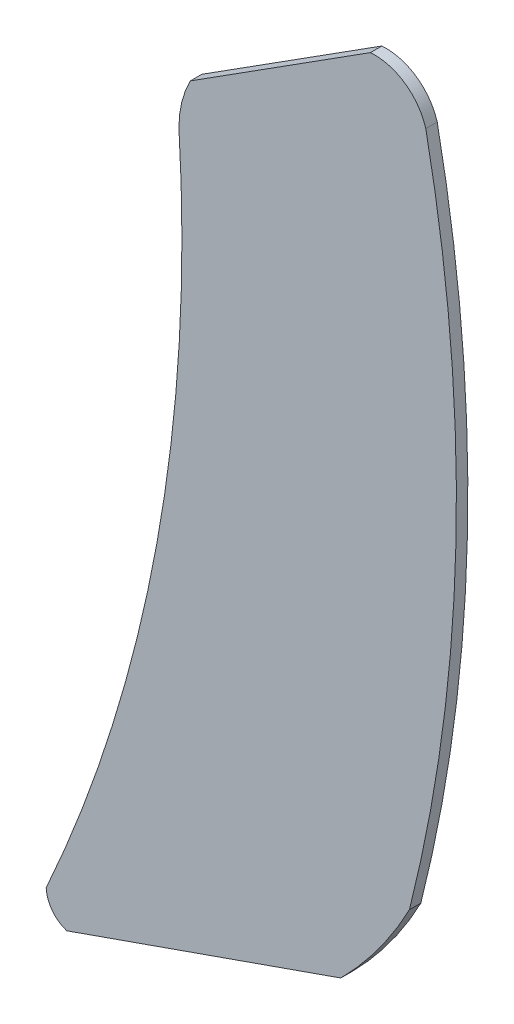
ISO-10303-21;
HEADER;
FILE_DESCRIPTION(('STEP AP214'),'2;1');
FILE_NAME('part.step','',(''),(''),'','','');
FILE_SCHEMA(('AUTOMOTIVE_DESIGN { 1 0 10303 214 1 1 1 1 }'));
ENDSEC;
DATA;
#1=APPLICATION_CONTEXT('core data for automotive mechanical design processes');
#2=APPLICATION_PROTOCOL_DEFINITION('international standard','automotive_design',2000,#1);
#3=PRODUCT_CONTEXT('',#1,'mechanical');
#4=PRODUCT('Part','Part','',(#3));
#5=PRODUCT_RELATED_PRODUCT_CATEGORY('part','',(#4));
#6=PRODUCT_DEFINITION_FORMATION('','',#4);
#7=PRODUCT_DEFINITION_CONTEXT('part definition',#1,'design');
#8=PRODUCT_DEFINITION('design','',#6,#7);
#9=PRODUCT_DEFINITION_SHAPE('','',#8);
#10=(LENGTH_UNIT() NAMED_UNIT(*) SI_UNIT(.MILLI.,.METRE.));
#11=(NAMED_UNIT(*) PLANE_ANGLE_UNIT() SI_UNIT($,.RADIAN.));
#12=(NAMED_UNIT(*) SI_UNIT($,.STERADIAN.) SOLID_ANGLE_UNIT());
#13=UNCERTAINTY_MEASURE_WITH_UNIT(LENGTH_MEASURE(1.E-05),#10,'distance_accuracy_value','');
#14=(GEOMETRIC_REPRESENTATION_CONTEXT(3) GLOBAL_UNCERTAINTY_ASSIGNED_CONTEXT((#13)) GLOBAL_UNIT_ASSIGNED_CONTEXT((#10,
#11,#12)) REPRESENTATION_CONTEXT('',''));
#15=CARTESIAN_POINT('',(0.,0.,0.));
#16=DIRECTION('',(0.,0.,1.));
#17=DIRECTION('',(1.,0.,0.));
#18=AXIS2_PLACEMENT_3D('',#15,#16,#17);
#19=CARTESIAN_POINT('',(0.,0.,3.));
#20=DIRECTION('',(0.331069532000412,-0.943606361244469,0.));
#21=DIRECTION('',(0.943606361244469,0.331069532000412,0.));
#22=AXIS2_PLACEMENT_3D('',#19,#20,#21);
#23=PLANE('',#22);
#24=DIRECTION('',(-0.94360636124447,-0.331069532000412,0.));
#25=VECTOR('',#24,1.);
#26=CARTESIAN_POINT('',(0.,0.,0.));
#27=LINE('',#26,#25);
#28=CARTESIAN_POINT('',(71.9105968064001,25.2302322328211,0.));
#29=VERTEX_POINT('',#28);
#30=CARTESIAN_POINT('',(0.,0.,0.));
#31=VERTEX_POINT('',#30);
#32=EDGE_CURVE('E131',#29,#31,#27,.T.);
#33=ORIENTED_EDGE('',*,*,#32,.F.);
#34=DIRECTION('',(0.,0.,-1.));
#35=VECTOR('',#34,1.);
#36=CARTESIAN_POINT('',(71.9105968064001,25.2302322328211,3.));
#37=LINE('',#36,#35);
#38=CARTESIAN_POINT('',(71.9105968064001,25.2302322328211,3.));
#39=VERTEX_POINT('',#38);
#40=EDGE_CURVE('E11',#39,#29,#37,.T.);
#41=ORIENTED_EDGE('',*,*,#40,.F.);
#42=DIRECTION('',(-0.94360636124447,-0.331069532000412,0.));
#43=VECTOR('',#42,1.);
#44=CARTESIAN_POINT('',(0.,0.,3.));
#45=LINE('',#44,#43);
#46=CARTESIAN_POINT('',(0.,0.,3.));
#47=VERTEX_POINT('',#46);
#48=EDGE_CURVE('E150',#39,#47,#45,.T.);
#49=ORIENTED_EDGE('',*,*,#48,.T.);
#50=DIRECTION('',(0.,0.,-1.));
#51=VECTOR('',#50,1.);
#52=CARTESIAN_POINT('',(0.,0.,3.));
#53=LINE('',#52,#51);
#54=EDGE_CURVE('E53',#47,#31,#53,.T.);
#55=ORIENTED_EDGE('',*,*,#54,.T.);
#56=EDGE_LOOP('',(#33,#41,#49,#55));
#57=FACE_BOUND('',#56,.T.);
#58=ADVANCED_FACE('F37',(#57),#23,.T.);
#59=CARTESIAN_POINT('',(-0.38101755031103,97.2046835969354,3.));
#60=DIRECTION('',(0.,0.,-1.));
#61=DIRECTION('',(-1.,0.,0.));
#62=AXIS2_PLACEMENT_3D('',#59,#60,#61);
#63=CYLINDRICAL_SURFACE('',#62,102.011759888087);
#64=CARTESIAN_POINT('',(-0.38101755031103,97.2046835969354,0.));
#65=DIRECTION('',(0.,0.,1.));
#66=DIRECTION('',(1.,0.,0.));
#67=AXIS2_PLACEMENT_3D('',#64,#65,#66);
#68=CIRCLE('',#67,102.011759888087);
#69=CARTESIAN_POINT('',(89.9105968064002,49.7302322328212,0.));
#70=VERTEX_POINT('',#69);
#71=EDGE_CURVE('E133',#70,#29,#68,.F.);
#72=ORIENTED_EDGE('',*,*,#71,.F.);
#73=DIRECTION('',(0.,0.,-1.));
#74=VECTOR('',#73,1.);
#75=CARTESIAN_POINT('',(89.9105968064002,49.7302322328212,3.));
#76=LINE('',#75,#74);
#77=CARTESIAN_POINT('',(89.9105968064002,49.7302322328212,3.));
#78=VERTEX_POINT('',#77);
#79=EDGE_CURVE('E45',#78,#70,#76,.T.);
#80=ORIENTED_EDGE('',*,*,#79,.F.);
#81=CARTESIAN_POINT('',(-0.38101755031103,97.2046835969354,3.));
#82=DIRECTION('',(0.,0.,1.));
#83=DIRECTION('',(1.,0.,0.));
#84=AXIS2_PLACEMENT_3D('',#81,#82,#83);
#85=CIRCLE('',#84,102.011759888087);
#86=EDGE_CURVE('E176',#78,#39,#85,.F.);
#87=ORIENTED_EDGE('',*,*,#86,.T.);
#88=ORIENTED_EDGE('',*,*,#40,.T.);
#89=EDGE_LOOP('',(#72,#80,#87,#88));
#90=FACE_BOUND('',#89,.T.);
#91=ADVANCED_FACE('F167',(#90),#63,.T.);
#92=CARTESIAN_POINT('',(-303.599309948518,149.045682586286,3.));
#93=DIRECTION('',(0.,0.,-1.));
#94=DIRECTION('',(-1.,0.,0.));
#95=AXIS2_PLACEMENT_3D('',#92,#93,#94);
#96=CYLINDRICAL_SURFACE('',#95,405.849239734629);
#97=CARTESIAN_POINT('',(-303.599309948518,149.045682586286,0.));
#98=DIRECTION('',(0.,0.,1.));
#99=DIRECTION('',(1.,0.,0.));
#100=AXIS2_PLACEMENT_3D('',#97,#98,#99);
#101=CIRCLE('',#100,405.849239734629);
#102=CARTESIAN_POINT('',(94.2105968064001,229.425303640502,0.));
#103=VERTEX_POINT('',#102);
#104=EDGE_CURVE('E136',#103,#70,#101,.F.);
#105=ORIENTED_EDGE('',*,*,#104,.F.);
#106=DIRECTION('',(0.,0.,-1.));
#107=VECTOR('',#106,1.);
#108=CARTESIAN_POINT('',(94.2105968064001,229.425303640502,3.));
#109=LINE('',#108,#107);
#110=CARTESIAN_POINT('',(94.2105968064001,229.425303640502,3.));
#111=VERTEX_POINT('',#110);
#112=EDGE_CURVE('E156',#111,#103,#109,.T.);
#113=ORIENTED_EDGE('',*,*,#112,.F.);
#114=CARTESIAN_POINT('',(-303.599309948518,149.045682586286,3.));
#115=DIRECTION('',(0.,0.,1.));
#116=DIRECTION('',(1.,0.,0.));
#117=AXIS2_PLACEMENT_3D('',#114,#115,#116);
#118=CIRCLE('',#117,405.849239734629);
#119=EDGE_CURVE('E163',#111,#78,#118,.F.);
#120=ORIENTED_EDGE('',*,*,#119,.T.);
#121=ORIENTED_EDGE('',*,*,#79,.T.);
#122=EDGE_LOOP('',(#105,#113,#120,#121));
#123=FACE_BOUND('',#122,.T.);
#124=ADVANCED_FACE('F161',(#123),#96,.T.);
#125=CARTESIAN_POINT('',(80.7813663194613,225.468566534164,3.));
#126=DIRECTION('',(0.,0.,-1.));
#127=DIRECTION('',(-1.,0.,0.));
#128=AXIS2_PLACEMENT_3D('',#125,#126,#127);
#129=CYLINDRICAL_SURFACE('',#128,14.);
#130=CARTESIAN_POINT('',(80.7813663194613,225.468566534164,0.));
#131=DIRECTION('',(0.,0.,1.));
#132=DIRECTION('',(1.,0.,0.));
#133=AXIS2_PLACEMENT_3D('',#130,#131,#132);
#134=CIRCLE('',#133,14.);
#135=CARTESIAN_POINT('',(79.6815984600628,239.425303640502,0.));
#136=VERTEX_POINT('',#135);
#137=EDGE_CURVE('E139',#136,#103,#134,.F.);
#138=ORIENTED_EDGE('',*,*,#137,.F.);
#139=DIRECTION('',(0.,0.,-1.));
#140=VECTOR('',#139,1.);
#141=CARTESIAN_POINT('',(79.6815984600628,239.425303640502,3.));
#142=LINE('',#141,#140);
#143=CARTESIAN_POINT('',(79.6815984600628,239.425303640502,3.));
#144=VERTEX_POINT('',#143);
#145=EDGE_CURVE('E154',#144,#136,#142,.T.);
#146=ORIENTED_EDGE('',*,*,#145,.F.);
#147=CARTESIAN_POINT('',(80.7813663194613,225.468566534164,3.));
#148=DIRECTION('',(0.,0.,1.));
#149=DIRECTION('',(1.,0.,0.));
#150=AXIS2_PLACEMENT_3D('',#147,#148,#149);
#151=CIRCLE('',#150,14.);
#152=EDGE_CURVE('E175',#144,#111,#151,.F.);
#153=ORIENTED_EDGE('',*,*,#152,.T.);
#154=ORIENTED_EDGE('',*,*,#112,.T.);
#155=EDGE_LOOP('',(#138,#146,#153,#154));
#156=FACE_BOUND('',#155,.T.);
#157=ADVANCED_FACE('F173',(#156),#129,.T.);
#158=CARTESIAN_POINT('',(-85.4717636133534,134.381321928581,3.));
#159=DIRECTION('',(0.536680517719669,-0.843785530748275,0.));
#160=DIRECTION('',(0.843785530748275,0.536680517719669,0.));
#161=AXIS2_PLACEMENT_3D('',#158,#159,#160);
#162=PLANE('',#161);
#163=DIRECTION('',(-0.843785530748275,-0.536680517719669,0.));
#164=VECTOR('',#163,1.);
#165=CARTESIAN_POINT('',(-85.4717636133534,134.381321928581,0.));
#166=LINE('',#165,#164);
#167=CARTESIAN_POINT('',(32.4296087381594,209.3711946482,0.));
#168=VERTEX_POINT('',#167);
#169=EDGE_CURVE('E142',#136,#168,#166,.T.);
#170=ORIENTED_EDGE('',*,*,#169,.T.);
#171=DIRECTION('',(0.,0.,-1.));
#172=VECTOR('',#171,1.);
#173=CARTESIAN_POINT('',(32.4296087381594,209.3711946482,3.));
#174=LINE('',#173,#172);
#175=CARTESIAN_POINT('',(32.4296087381594,209.3711946482,3.));
#176=VERTEX_POINT('',#175);
#177=EDGE_CURVE('E123',#176,#168,#174,.T.);
#178=ORIENTED_EDGE('',*,*,#177,.F.);
#179=DIRECTION('',(-0.843785530748275,-0.536680517719669,0.));
#180=VECTOR('',#179,1.);
#181=CARTESIAN_POINT('',(-85.4717636133534,134.381321928581,3.));
#182=LINE('',#181,#180);
#183=EDGE_CURVE('E111',#144,#176,#182,.T.);
#184=ORIENTED_EDGE('',*,*,#183,.F.);
#185=ORIENTED_EDGE('',*,*,#145,.T.);
#186=EDGE_LOOP('',(#170,#178,#184,#185));
#187=FACE_BOUND('',#186,.T.);
#188=ADVANCED_FACE('F202',(#187),#162,.F.);
#189=CARTESIAN_POINT('',(55.3946523151456,197.255200325991,3.));
#190=DIRECTION('',(0.,0.,-1.));
#191=DIRECTION('',(-1.,0.,0.));
#192=AXIS2_PLACEMENT_3D('',#189,#190,#191);
#193=CYLINDRICAL_SURFACE('',#192,25.9651794699881);
#194=CARTESIAN_POINT('',(55.3946523151456,197.255200325991,0.));
#195=DIRECTION('',(0.,0.,1.));
#196=DIRECTION('',(1.,0.,0.));
#197=AXIS2_PLACEMENT_3D('',#194,#195,#196);
#198=CIRCLE('',#197,25.9651794699881);
#199=CARTESIAN_POINT('',(29.4296087381594,197.1711946482,0.));
#200=VERTEX_POINT('',#199);
#201=EDGE_CURVE('E120',#168,#200,#198,.T.);
#202=ORIENTED_EDGE('',*,*,#201,.T.);
#203=DIRECTION('',(0.,0.,-1.));
#204=VECTOR('',#203,1.);
#205=CARTESIAN_POINT('',(29.4296087381594,197.1711946482,3.));
#206=LINE('',#205,#204);
#207=CARTESIAN_POINT('',(29.4296087381594,197.1711946482,3.));
#208=VERTEX_POINT('',#207);
#209=EDGE_CURVE('E117',#208,#200,#206,.T.);
#210=ORIENTED_EDGE('',*,*,#209,.F.);
#211=CARTESIAN_POINT('',(55.3946523151456,197.255200325991,3.));
#212=DIRECTION('',(0.,0.,1.));
#213=DIRECTION('',(1.,0.,0.));
#214=AXIS2_PLACEMENT_3D('',#211,#212,#213);
#215=CIRCLE('',#214,25.9651794699881);
#216=EDGE_CURVE('E103',#176,#208,#215,.T.);
#217=ORIENTED_EDGE('',*,*,#216,.F.);
#218=ORIENTED_EDGE('',*,*,#177,.T.);
#219=EDGE_LOOP('',(#202,#210,#217,#218));
#220=FACE_BOUND('',#219,.T.);
#221=ADVANCED_FACE('F118',(#220),#193,.T.);
#222=CARTESIAN_POINT('',(-369.78380588021,172.098309119376,3.));
#223=DIRECTION('',(0.,0.,-1.));
#224=DIRECTION('',(-1.,0.,0.));
#225=AXIS2_PLACEMENT_3D('',#222,#223,#224);
#226=CYLINDRICAL_SURFACE('',#225,400.);
#227=CARTESIAN_POINT('',(-369.78380588021,172.098309119376,0.));
#228=DIRECTION('',(0.,0.,1.));
#229=DIRECTION('',(1.,0.,0.));
#230=AXIS2_PLACEMENT_3D('',#227,#228,#229);
#231=CIRCLE('',#230,400.);
#232=CARTESIAN_POINT('',(-5.4,7.09999999999999,0.));
#233=VERTEX_POINT('',#232);
#234=EDGE_CURVE('E145',#200,#233,#231,.F.);
#235=ORIENTED_EDGE('',*,*,#234,.T.);
#236=DIRECTION('',(0.,0.,-1.));
#237=VECTOR('',#236,1.);
#238=CARTESIAN_POINT('',(-5.4,7.09999999999999,3.));
#239=LINE('',#238,#237);
#240=CARTESIAN_POINT('',(-5.4,7.09999999999999,3.));
#241=VERTEX_POINT('',#240);
#242=EDGE_CURVE('E79',#241,#233,#239,.T.);
#243=ORIENTED_EDGE('',*,*,#242,.F.);
#244=CARTESIAN_POINT('',(-369.78380588021,172.098309119376,3.));
#245=DIRECTION('',(0.,0.,1.));
#246=DIRECTION('',(1.,0.,0.));
#247=AXIS2_PLACEMENT_3D('',#244,#245,#246);
#248=CIRCLE('',#247,400.);
#249=EDGE_CURVE('E108',#208,#241,#248,.F.);
#250=ORIENTED_EDGE('',*,*,#249,.F.);
#251=ORIENTED_EDGE('',*,*,#209,.T.);
#252=EDGE_LOOP('',(#235,#243,#250,#251));
#253=FACE_BOUND('',#252,.T.);
#254=ADVANCED_FACE('F125',(#253),#226,.F.);
#255=CARTESIAN_POINT('',(2.34897006305709,7.39006173809977,3.));
#256=DIRECTION('',(0.,0.,-1.));
#257=DIRECTION('',(-1.,0.,0.));
#258=AXIS2_PLACEMENT_3D('',#255,#256,#257);
#259=CYLINDRICAL_SURFACE('',#258,7.75439700106105);
#260=CARTESIAN_POINT('',(2.34897006305709,7.39006173809977,0.));
#261=DIRECTION('',(0.,0.,1.));
#262=DIRECTION('',(1.,0.,0.));
#263=AXIS2_PLACEMENT_3D('',#260,#261,#262);
#264=CIRCLE('',#263,7.75439700106105);
#265=EDGE_CURVE('E147',#31,#233,#264,.F.);
#266=ORIENTED_EDGE('',*,*,#265,.F.);
#267=ORIENTED_EDGE('',*,*,#54,.F.);
#268=CARTESIAN_POINT('',(2.34897006305709,7.39006173809977,3.));
#269=DIRECTION('',(0.,0.,1.));
#270=DIRECTION('',(1.,0.,0.));
#271=AXIS2_PLACEMENT_3D('',#268,#269,#270);
#272=CIRCLE('',#271,7.75439700106105);
#273=EDGE_CURVE('E126',#47,#241,#272,.F.);
#274=ORIENTED_EDGE('',*,*,#273,.T.);
#275=ORIENTED_EDGE('',*,*,#242,.T.);
#276=EDGE_LOOP('',(#266,#267,#274,#275));
#277=FACE_BOUND('',#276,.T.);
#278=ADVANCED_FACE('F181',(#277),#259,.T.);
#279=CARTESIAN_POINT('',(0.,0.,3.));
#280=DIRECTION('',(0.,0.,1.));
#281=DIRECTION('',(1.,0.,0.));
#282=AXIS2_PLACEMENT_3D('',#279,#280,#281);
#283=PLANE('',#282);
#284=ORIENTED_EDGE('',*,*,#48,.F.);
#285=ORIENTED_EDGE('',*,*,#86,.F.);
#286=ORIENTED_EDGE('',*,*,#119,.F.);
#287=ORIENTED_EDGE('',*,*,#152,.F.);
#288=ORIENTED_EDGE('',*,*,#183,.T.);
#289=ORIENTED_EDGE('',*,*,#216,.T.);
#290=ORIENTED_EDGE('',*,*,#249,.T.);
#291=ORIENTED_EDGE('',*,*,#273,.F.);
#292=EDGE_LOOP('',(#284,#285,#286,#287,#288,#289,#290,#291));
#293=FACE_BOUND('',#292,.T.);
#294=ADVANCED_FACE('F105',(#293),#283,.T.);
#295=CARTESIAN_POINT('',(0.,0.,0.));
#296=DIRECTION('',(0.,0.,1.));
#297=DIRECTION('',(1.,0.,0.));
#298=AXIS2_PLACEMENT_3D('',#295,#296,#297);
#299=PLANE('',#298);
#300=ORIENTED_EDGE('',*,*,#32,.T.);
#301=ORIENTED_EDGE('',*,*,#265,.T.);
#302=ORIENTED_EDGE('',*,*,#234,.F.);
#303=ORIENTED_EDGE('',*,*,#201,.F.);
#304=ORIENTED_EDGE('',*,*,#169,.F.);
#305=ORIENTED_EDGE('',*,*,#137,.T.);
#306=ORIENTED_EDGE('',*,*,#104,.T.);
#307=ORIENTED_EDGE('',*,*,#71,.T.);
#308=EDGE_LOOP('',(#300,#301,#302,#303,#304,#305,#306,#307));
#309=FACE_BOUND('',#308,.T.);
#310=ADVANCED_FACE('F169',(#309),#299,.F.);
#311=CLOSED_SHELL('',(#58,#91,#124,#157,#188,#221,#254,#278,#294,#310));
#312=MANIFOLD_SOLID_BREP('B2',#311);
#313=ADVANCED_BREP_SHAPE_REPRESENTATION('',(#18,#312),#14);
#314=SHAPE_DEFINITION_REPRESENTATION(#9,#313);
ENDSEC;
END-ISO-10303-21;
